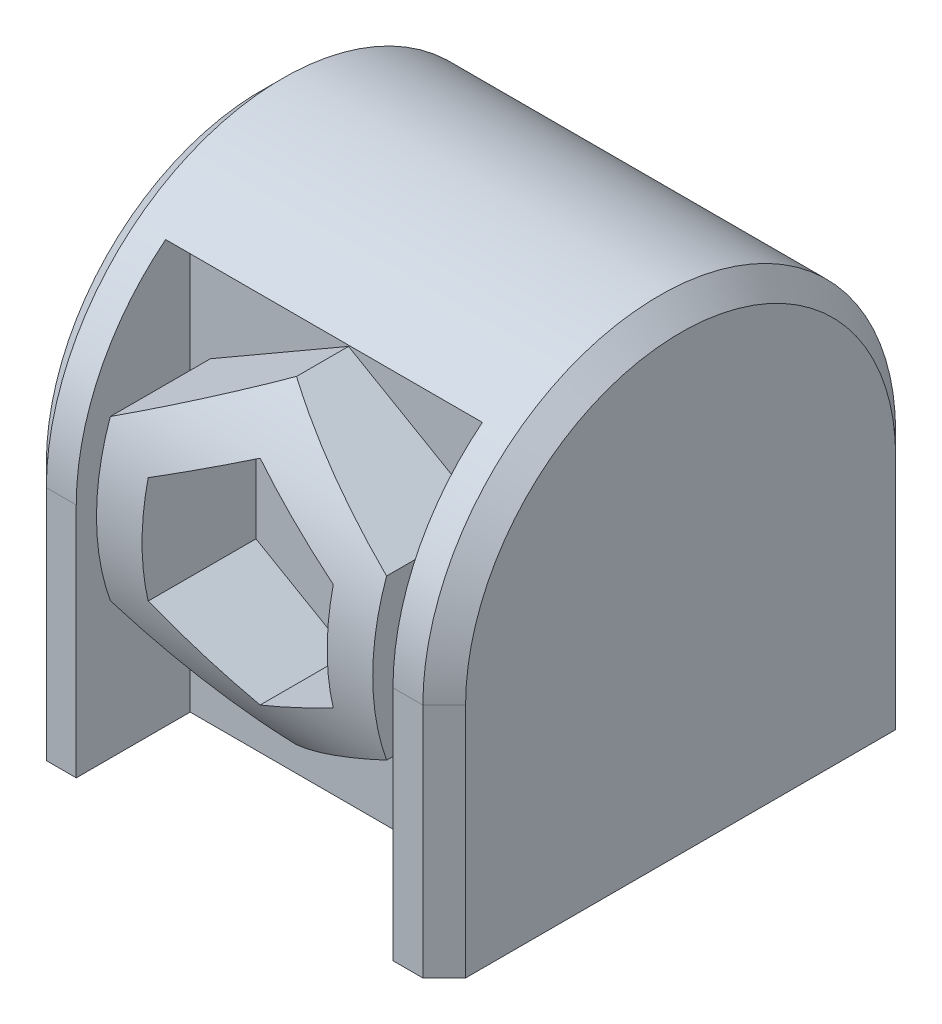
ISO-10303-21;
HEADER;
FILE_DESCRIPTION(('STEP AP214'),'2;1');
FILE_NAME('part.step','',(''),(''),'','','');
FILE_SCHEMA(('AUTOMOTIVE_DESIGN { 1 0 10303 214 1 1 1 1 }'));
ENDSEC;
DATA;
#1=APPLICATION_CONTEXT('core data for automotive mechanical design processes');
#2=APPLICATION_PROTOCOL_DEFINITION('international standard','automotive_design',2000,#1);
#3=PRODUCT_CONTEXT('',#1,'mechanical');
#4=PRODUCT('Part','Part','',(#3));
#5=PRODUCT_RELATED_PRODUCT_CATEGORY('part','',(#4));
#6=PRODUCT_DEFINITION_FORMATION('','',#4);
#7=PRODUCT_DEFINITION_CONTEXT('part definition',#1,'design');
#8=PRODUCT_DEFINITION('design','',#6,#7);
#9=PRODUCT_DEFINITION_SHAPE('','',#8);
#10=(LENGTH_UNIT() NAMED_UNIT(*) SI_UNIT(.MILLI.,.METRE.));
#11=(NAMED_UNIT(*) PLANE_ANGLE_UNIT() SI_UNIT($,.RADIAN.));
#12=(NAMED_UNIT(*) SI_UNIT($,.STERADIAN.) SOLID_ANGLE_UNIT());
#13=UNCERTAINTY_MEASURE_WITH_UNIT(LENGTH_MEASURE(1.E-05),#10,'distance_accuracy_value','');
#14=(GEOMETRIC_REPRESENTATION_CONTEXT(3) GLOBAL_UNCERTAINTY_ASSIGNED_CONTEXT((#13)) GLOBAL_UNIT_ASSIGNED_CONTEXT((#10,
#11,#12)) REPRESENTATION_CONTEXT('',''));
#15=CARTESIAN_POINT('',(0.,0.,0.));
#16=DIRECTION('',(0.,0.,1.));
#17=DIRECTION('',(1.,0.,0.));
#18=AXIS2_PLACEMENT_3D('',#15,#16,#17);
#19=CARTESIAN_POINT('',(0.,0.,5.461));
#20=DIRECTION('',(0.,0.,-1.));
#21=DIRECTION('',(-1.,0.,0.));
#22=AXIS2_PLACEMENT_3D('',#19,#20,#21);
#23=PLANE('',#22);
#24=DIRECTION('',(0.,1.,0.));
#25=VECTOR('',#24,1.);
#26=CARTESIAN_POINT('',(16.4084,-10.541,5.461));
#27=LINE('',#26,#25);
#28=CARTESIAN_POINT('',(16.4084,-10.541,5.461));
#29=VERTEX_POINT('',#28);
#30=CARTESIAN_POINT('',(16.4084,8.255,5.461));
#31=VERTEX_POINT('',#30);
#32=EDGE_CURVE('E398',#29,#31,#27,.T.);
#33=ORIENTED_EDGE('',*,*,#32,.T.);
#34=DIRECTION('',(-1.,0.,0.));
#35=VECTOR('',#34,1.);
#36=CARTESIAN_POINT('',(2.286,8.255,5.461));
#37=LINE('',#36,#35);
#38=CARTESIAN_POINT('',(2.286,8.255,5.461));
#39=VERTEX_POINT('',#38);
#40=EDGE_CURVE('E284',#31,#39,#37,.T.);
#41=ORIENTED_EDGE('',*,*,#40,.T.);
#42=DIRECTION('',(0.,-1.,0.));
#43=VECTOR('',#42,1.);
#44=CARTESIAN_POINT('',(2.286,-10.541,5.461));
#45=LINE('',#44,#43);
#46=CARTESIAN_POINT('',(2.286,-10.541,5.461));
#47=VERTEX_POINT('',#46);
#48=EDGE_CURVE('E264',#39,#47,#45,.T.);
#49=ORIENTED_EDGE('',*,*,#48,.T.);
#50=DIRECTION('',(1.,0.,0.));
#51=VECTOR('',#50,1.);
#52=CARTESIAN_POINT('',(2.286,-10.541,5.461));
#53=LINE('',#52,#51);
#54=EDGE_CURVE('E273',#47,#29,#53,.T.);
#55=ORIENTED_EDGE('',*,*,#54,.T.);
#56=EDGE_LOOP('',(#33,#41,#49,#55));
#57=FACE_BOUND('',#56,.T.);
#58=DIRECTION('',(-0.866025403784442,0.499999999999995,0.));
#59=VECTOR('',#58,1.);
#60=CARTESIAN_POINT('',(5.4163863358574,9.38145632712696,5.461));
#61=LINE('',#60,#59);
#62=CARTESIAN_POINT('',(15.5063726717149,3.55600000000007,5.461));
#63=VERTEX_POINT('',#62);
#64=CARTESIAN_POINT('',(9.3472,7.112,5.461));
#65=VERTEX_POINT('',#64);
#66=EDGE_CURVE('E11',#63,#65,#61,.T.);
#67=ORIENTED_EDGE('',*,*,#66,.F.);
#68=DIRECTION('',(0.,1.,0.));
#69=VECTOR('',#68,1.);
#70=CARTESIAN_POINT('',(15.5063726717149,1.6263618590233E-13,5.461));
#71=LINE('',#70,#69);
#72=CARTESIAN_POINT('',(15.506372671715,-3.55599999999994,5.461));
#73=VERTEX_POINT('',#72);
#74=EDGE_CURVE('E419',#73,#63,#71,.T.);
#75=ORIENTED_EDGE('',*,*,#74,.F.);
#76=DIRECTION('',(0.866025403784435,0.500000000000007,0.));
#77=VECTOR('',#76,1.);
#78=CARTESIAN_POINT('',(5.41638633585757,-9.38145632712696,5.461));
#79=LINE('',#78,#77);
#80=CARTESIAN_POINT('',(9.34720000000005,-7.112,5.461));
#81=VERTEX_POINT('',#80);
#82=EDGE_CURVE('E422',#81,#73,#79,.T.);
#83=ORIENTED_EDGE('',*,*,#82,.F.);
#84=DIRECTION('',(0.866025403784442,-0.499999999999995,0.));
#85=VECTOR('',#84,1.);
#86=CARTESIAN_POINT('',(-0.742786335857478,-1.28654367287309,5.461));
#87=LINE('',#86,#85);
#88=CARTESIAN_POINT('',(3.18802732828509,-3.55600000000003,5.461));
#89=VERTEX_POINT('',#88);
#90=EDGE_CURVE('E425',#89,#81,#87,.T.);
#91=ORIENTED_EDGE('',*,*,#90,.F.);
#92=DIRECTION('',(0.,-1.,0.));
#93=VECTOR('',#92,1.);
#94=CARTESIAN_POINT('',(3.18802732828508,0.,5.461));
#95=LINE('',#94,#93);
#96=CARTESIAN_POINT('',(3.18802732828506,3.55599999999999,5.461));
#97=VERTEX_POINT('',#96);
#98=EDGE_CURVE('E53',#97,#89,#95,.T.);
#99=ORIENTED_EDGE('',*,*,#98,.F.);
#100=DIRECTION('',(-0.866025403784438,-0.500000000000001,0.));
#101=VECTOR('',#100,1.);
#102=CARTESIAN_POINT('',(-0.742786335857459,1.28654367287304,5.461));
#103=LINE('',#102,#101);
#104=EDGE_CURVE('E43',#65,#97,#103,.T.);
#105=ORIENTED_EDGE('',*,*,#104,.F.);
#106=EDGE_LOOP('',(#67,#75,#83,#91,#99,#105));
#107=FACE_BOUND('',#106,.T.);
#108=ADVANCED_FACE('F34',(#57,#107),#23,.F.);
#109=CARTESIAN_POINT('',(2.286,8.255,4.191));
#110=DIRECTION('',(0.,1.,0.));
#111=DIRECTION('',(0.,0.,1.));
#112=AXIS2_PLACEMENT_3D('',#109,#110,#111);
#113=PLANE('',#112);
#114=ORIENTED_EDGE('',*,*,#40,.F.);
#115=DIRECTION('',(0.,0.,1.));
#116=VECTOR('',#115,1.);
#117=CARTESIAN_POINT('',(16.4084,8.255,4.191));
#118=LINE('',#117,#116);
#119=CARTESIAN_POINT('',(16.4084,8.255,6.55497185348648));
#120=VERTEX_POINT('',#119);
#121=EDGE_CURVE('E316',#31,#120,#118,.T.);
#122=ORIENTED_EDGE('',*,*,#121,.T.);
#123=DIRECTION('',(-1.,0.,0.));
#124=VECTOR('',#123,1.);
#125=CARTESIAN_POINT('',(18.6944,8.255,6.55497185348648));
#126=LINE('',#125,#124);
#127=CARTESIAN_POINT('',(2.286,8.255,6.55497185348648));
#128=VERTEX_POINT('',#127);
#129=EDGE_CURVE('E384',#128,#120,#126,.F.);
#130=ORIENTED_EDGE('',*,*,#129,.F.);
#131=DIRECTION('',(0.,0.,1.));
#132=VECTOR('',#131,1.);
#133=CARTESIAN_POINT('',(2.286,8.255,4.191));
#134=LINE('',#133,#132);
#135=EDGE_CURVE('E313',#39,#128,#134,.T.);
#136=ORIENTED_EDGE('',*,*,#135,.F.);
#137=EDGE_LOOP('',(#114,#122,#130,#136));
#138=FACE_BOUND('',#137,.T.);
#139=ADVANCED_FACE('F472',(#138),#113,.F.);
#140=CARTESIAN_POINT('',(2.286,-10.541,4.191));
#141=DIRECTION('',(-1.,0.,0.));
#142=DIRECTION('',(0.,0.,1.));
#143=AXIS2_PLACEMENT_3D('',#140,#141,#142);
#144=PLANE('',#143);
#145=ORIENTED_EDGE('',*,*,#48,.F.);
#146=ORIENTED_EDGE('',*,*,#135,.T.);
#147=CARTESIAN_POINT('',(2.286,0.,0.));
#148=DIRECTION('',(-1.,0.,0.));
#149=DIRECTION('',(0.,0.,1.));
#150=AXIS2_PLACEMENT_3D('',#147,#148,#149);
#151=CIRCLE('',#150,10.541);
#152=CARTESIAN_POINT('',(2.286,0.,10.541));
#153=VERTEX_POINT('',#152);
#154=EDGE_CURVE('E323',#153,#128,#151,.T.);
#155=ORIENTED_EDGE('',*,*,#154,.F.);
#156=DIRECTION('',(0.,-1.,0.));
#157=VECTOR('',#156,1.);
#158=CARTESIAN_POINT('',(2.286,-10.541,10.541));
#159=LINE('',#158,#157);
#160=CARTESIAN_POINT('',(2.286,-10.541,10.541));
#161=VERTEX_POINT('',#160);
#162=EDGE_CURVE('E307',#153,#161,#159,.T.);
#163=ORIENTED_EDGE('',*,*,#162,.T.);
#164=DIRECTION('',(0.,0.,1.));
#165=VECTOR('',#164,1.);
#166=CARTESIAN_POINT('',(2.286,-10.541,4.191));
#167=LINE('',#166,#165);
#168=EDGE_CURVE('E312',#47,#161,#167,.T.);
#169=ORIENTED_EDGE('',*,*,#168,.F.);
#170=EDGE_LOOP('',(#145,#146,#155,#163,#169));
#171=FACE_BOUND('',#170,.T.);
#172=ADVANCED_FACE('F479',(#171),#144,.F.);
#173=CARTESIAN_POINT('',(16.4084,-10.541,4.191));
#174=DIRECTION('',(1.,0.,0.));
#175=DIRECTION('',(0.,0.,-1.));
#176=AXIS2_PLACEMENT_3D('',#173,#174,#175);
#177=PLANE('',#176);
#178=ORIENTED_EDGE('',*,*,#32,.F.);
#179=DIRECTION('',(0.,0.,1.));
#180=VECTOR('',#179,1.);
#181=CARTESIAN_POINT('',(16.4084,-10.541,4.191));
#182=LINE('',#181,#180);
#183=CARTESIAN_POINT('',(16.4084,-10.541,10.541));
#184=VERTEX_POINT('',#183);
#185=EDGE_CURVE('E318',#29,#184,#182,.T.);
#186=ORIENTED_EDGE('',*,*,#185,.T.);
#187=DIRECTION('',(0.,1.,0.));
#188=VECTOR('',#187,1.);
#189=CARTESIAN_POINT('',(16.4084,-10.541,10.541));
#190=LINE('',#189,#188);
#191=CARTESIAN_POINT('',(16.4084,0.,10.541));
#192=VERTEX_POINT('',#191);
#193=EDGE_CURVE('E310',#184,#192,#190,.T.);
#194=ORIENTED_EDGE('',*,*,#193,.T.);
#195=CARTESIAN_POINT('',(16.4084,0.,0.));
#196=DIRECTION('',(1.,0.,0.));
#197=DIRECTION('',(0.,0.,-1.));
#198=AXIS2_PLACEMENT_3D('',#195,#196,#197);
#199=CIRCLE('',#198,10.541);
#200=EDGE_CURVE('E315',#120,#192,#199,.T.);
#201=ORIENTED_EDGE('',*,*,#200,.F.);
#202=ORIENTED_EDGE('',*,*,#121,.F.);
#203=EDGE_LOOP('',(#178,#186,#194,#201,#202));
#204=FACE_BOUND('',#203,.T.);
#205=ADVANCED_FACE('F647',(#204),#177,.F.);
#206=CARTESIAN_POINT('',(18.6944,0.,10.541));
#207=DIRECTION('',(0.,0.,-1.));
#208=DIRECTION('',(-1.,0.,0.));
#209=AXIS2_PLACEMENT_3D('',#206,#207,#208);
#210=PLANE('',#209);
#211=DIRECTION('',(-1.,0.,0.));
#212=VECTOR('',#211,1.);
#213=CARTESIAN_POINT('',(18.6944,-10.541,10.541));
#214=LINE('',#213,#212);
#215=CARTESIAN_POINT('',(0.952500000000005,-10.541,10.541));
#216=VERTEX_POINT('',#215);
#217=EDGE_CURVE('E337',#161,#216,#214,.T.);
#218=ORIENTED_EDGE('',*,*,#217,.F.);
#219=ORIENTED_EDGE('',*,*,#162,.F.);
#220=DIRECTION('',(-1.,0.,0.));
#221=VECTOR('',#220,1.);
#222=CARTESIAN_POINT('',(18.6944,0.,10.541));
#223=LINE('',#222,#221);
#224=CARTESIAN_POINT('',(0.952500000000002,0.,10.541));
#225=VERTEX_POINT('',#224);
#226=EDGE_CURVE('E341',#153,#225,#223,.T.);
#227=ORIENTED_EDGE('',*,*,#226,.T.);
#228=DIRECTION('',(0.,-1.,0.));
#229=VECTOR('',#228,1.);
#230=CARTESIAN_POINT('',(0.952500000000002,0.,10.541));
#231=LINE('',#230,#229);
#232=EDGE_CURVE('E369',#225,#216,#231,.T.);
#233=ORIENTED_EDGE('',*,*,#232,.T.);
#234=EDGE_LOOP('',(#218,#219,#227,#233));
#235=FACE_BOUND('',#234,.T.);
#236=ADVANCED_FACE('F672',(#235),#210,.F.);
#237=CARTESIAN_POINT('',(18.6944,-10.541,-10.541));
#238=DIRECTION('',(0.,0.,1.));
#239=DIRECTION('',(1.,0.,0.));
#240=AXIS2_PLACEMENT_3D('',#237,#238,#239);
#241=PLANE('',#240);
#242=DIRECTION('',(-1.,0.,0.));
#243=VECTOR('',#242,1.);
#244=CARTESIAN_POINT('',(18.6944,-10.541,-10.541));
#245=LINE('',#244,#243);
#246=CARTESIAN_POINT('',(17.7419,-10.541,-10.541));
#247=VERTEX_POINT('',#246);
#248=CARTESIAN_POINT('',(0.952500000000005,-10.541,-10.541));
#249=VERTEX_POINT('',#248);
#250=EDGE_CURVE('E330',#247,#249,#245,.T.);
#251=ORIENTED_EDGE('',*,*,#250,.T.);
#252=DIRECTION('',(0.,1.,0.));
#253=VECTOR('',#252,1.);
#254=CARTESIAN_POINT('',(0.952500000000002,-10.541,-10.541));
#255=LINE('',#254,#253);
#256=CARTESIAN_POINT('',(0.952500000000002,0.,-10.541));
#257=VERTEX_POINT('',#256);
#258=EDGE_CURVE('E350',#249,#257,#255,.T.);
#259=ORIENTED_EDGE('',*,*,#258,.T.);
#260=DIRECTION('',(-1.,0.,0.));
#261=VECTOR('',#260,1.);
#262=CARTESIAN_POINT('',(18.6944,0.,-10.541));
#263=LINE('',#262,#261);
#264=CARTESIAN_POINT('',(17.7419,0.,-10.541));
#265=VERTEX_POINT('',#264);
#266=EDGE_CURVE('E345',#265,#257,#263,.T.);
#267=ORIENTED_EDGE('',*,*,#266,.F.);
#268=DIRECTION('',(0.,-1.,0.));
#269=VECTOR('',#268,1.);
#270=CARTESIAN_POINT('',(17.7419,-10.541,-10.541));
#271=LINE('',#270,#269);
#272=EDGE_CURVE('E348',#265,#247,#271,.T.);
#273=ORIENTED_EDGE('',*,*,#272,.T.);
#274=EDGE_LOOP('',(#251,#259,#267,#273));
#275=FACE_BOUND('',#274,.T.);
#276=ADVANCED_FACE('F704',(#275),#241,.F.);
#277=CARTESIAN_POINT('',(18.6944,0.,0.));
#278=DIRECTION('',(-1.,0.,0.));
#279=DIRECTION('',(0.,0.,1.));
#280=AXIS2_PLACEMENT_3D('',#277,#278,#279);
#281=CYLINDRICAL_SURFACE('',#280,10.541);
#282=ORIENTED_EDGE('',*,*,#226,.F.);
#283=ORIENTED_EDGE('',*,*,#154,.T.);
#284=ORIENTED_EDGE('',*,*,#129,.T.);
#285=ORIENTED_EDGE('',*,*,#200,.T.);
#286=CARTESIAN_POINT('',(17.7419,0.,10.541));
#287=VERTEX_POINT('',#286);
#288=EDGE_CURVE('E342',#287,#192,#223,.T.);
#289=ORIENTED_EDGE('',*,*,#288,.F.);
#290=CARTESIAN_POINT('',(17.7419,0.,0.));
#291=DIRECTION('',(1.,0.,0.));
#292=DIRECTION('',(0.,0.,-1.));
#293=AXIS2_PLACEMENT_3D('',#290,#291,#292);
#294=CIRCLE('',#293,10.541);
#295=EDGE_CURVE('E372',#287,#265,#294,.F.);
#296=ORIENTED_EDGE('',*,*,#295,.T.);
#297=ORIENTED_EDGE('',*,*,#266,.T.);
#298=CARTESIAN_POINT('',(0.952500000000002,0.,0.));
#299=DIRECTION('',(1.,0.,0.));
#300=DIRECTION('',(0.,0.,-1.));
#301=AXIS2_PLACEMENT_3D('',#298,#299,#300);
#302=CIRCLE('',#301,10.541);
#303=EDGE_CURVE('E374',#257,#225,#302,.T.);
#304=ORIENTED_EDGE('',*,*,#303,.T.);
#305=EDGE_LOOP('',(#282,#283,#284,#285,#289,#296,#297,#304));
#306=FACE_BOUND('',#305,.T.);
#307=ADVANCED_FACE('F701',(#306),#281,.T.);
#308=ORIENTED_EDGE('',*,*,#288,.T.);
#309=ORIENTED_EDGE('',*,*,#193,.F.);
#310=CARTESIAN_POINT('',(17.7419,-10.541,10.541));
#311=VERTEX_POINT('',#310);
#312=EDGE_CURVE('E338',#311,#184,#214,.T.);
#313=ORIENTED_EDGE('',*,*,#312,.F.);
#314=DIRECTION('',(0.,1.,0.));
#315=VECTOR('',#314,1.);
#316=CARTESIAN_POINT('',(17.7419,0.,10.541));
#317=LINE('',#316,#315);
#318=EDGE_CURVE('E367',#311,#287,#317,.T.);
#319=ORIENTED_EDGE('',*,*,#318,.T.);
#320=EDGE_LOOP('',(#308,#309,#313,#319));
#321=FACE_BOUND('',#320,.T.);
#322=ADVANCED_FACE('F688',(#321),#210,.F.);
#323=CARTESIAN_POINT('',(18.6944,-10.541,10.541));
#324=DIRECTION('',(0.,1.,0.));
#325=DIRECTION('',(0.,0.,1.));
#326=AXIS2_PLACEMENT_3D('',#323,#324,#325);
#327=PLANE('',#326);
#328=ORIENTED_EDGE('',*,*,#185,.F.);
#329=ORIENTED_EDGE('',*,*,#54,.F.);
#330=ORIENTED_EDGE('',*,*,#168,.T.);
#331=ORIENTED_EDGE('',*,*,#217,.T.);
#332=DIRECTION('',(0.707106781186547,0.,0.707106781186548));
#333=VECTOR('',#332,1.);
#334=CARTESIAN_POINT('',(0.952500000000002,-10.541,10.541));
#335=LINE('',#334,#333);
#336=CARTESIAN_POINT('',(0.,-10.541,9.5885));
#337=VERTEX_POINT('',#336);
#338=EDGE_CURVE('E363',#216,#337,#335,.F.);
#339=ORIENTED_EDGE('',*,*,#338,.T.);
#340=DIRECTION('',(0.,0.,-1.));
#341=VECTOR('',#340,1.);
#342=CARTESIAN_POINT('',(0.,-10.541,10.541));
#343=LINE('',#342,#341);
#344=CARTESIAN_POINT('',(0.,-10.541,-9.58849999999999));
#345=VERTEX_POINT('',#344);
#346=EDGE_CURVE('E331',#337,#345,#343,.T.);
#347=ORIENTED_EDGE('',*,*,#346,.T.);
#348=DIRECTION('',(-0.707106781186547,0.,0.707106781186548));
#349=VECTOR('',#348,1.);
#350=CARTESIAN_POINT('',(0.952500000000002,-10.541,-10.541));
#351=LINE('',#350,#349);
#352=EDGE_CURVE('E365',#345,#249,#351,.F.);
#353=ORIENTED_EDGE('',*,*,#352,.T.);
#354=ORIENTED_EDGE('',*,*,#250,.F.);
#355=DIRECTION('',(0.707106781186549,0.,0.707106781186546));
#356=VECTOR('',#355,1.);
#357=CARTESIAN_POINT('',(18.6944,-10.541,-9.58850000000001));
#358=LINE('',#357,#356);
#359=CARTESIAN_POINT('',(18.6944,-10.541,-9.58850000000001));
#360=VERTEX_POINT('',#359);
#361=EDGE_CURVE('E361',#247,#360,#358,.T.);
#362=ORIENTED_EDGE('',*,*,#361,.T.);
#363=DIRECTION('',(0.,0.,-1.));
#364=VECTOR('',#363,1.);
#365=CARTESIAN_POINT('',(18.6944,-10.541,10.541));
#366=LINE('',#365,#364);
#367=CARTESIAN_POINT('',(18.6944,-10.541,9.58850000000001));
#368=VERTEX_POINT('',#367);
#369=EDGE_CURVE('E327',#368,#360,#366,.T.);
#370=ORIENTED_EDGE('',*,*,#369,.F.);
#371=DIRECTION('',(-0.707106781186549,0.,0.707106781186546));
#372=VECTOR('',#371,1.);
#373=CARTESIAN_POINT('',(18.6944,-10.541,9.58850000000001));
#374=LINE('',#373,#372);
#375=EDGE_CURVE('E359',#368,#311,#374,.T.);
#376=ORIENTED_EDGE('',*,*,#375,.T.);
#377=ORIENTED_EDGE('',*,*,#312,.T.);
#378=EDGE_LOOP('',(#328,#329,#330,#331,#339,#347,#353,#354,#362,#370,#376,#377));
#379=FACE_BOUND('',#378,.T.);
#380=ADVANCED_FACE('F682',(#379),#327,.F.);
#381=CARTESIAN_POINT('',(18.6944,0.,0.));
#382=DIRECTION('',(1.,0.,0.));
#383=DIRECTION('',(0.,0.,-1.));
#384=AXIS2_PLACEMENT_3D('',#381,#382,#383);
#385=PLANE('',#384);
#386=ORIENTED_EDGE('',*,*,#369,.T.);
#387=DIRECTION('',(0.,1.,0.));
#388=VECTOR('',#387,1.);
#389=CARTESIAN_POINT('',(18.6944,0.,-9.58850000000001));
#390=LINE('',#389,#388);
#391=CARTESIAN_POINT('',(18.6944,0.,-9.58850000000001));
#392=VERTEX_POINT('',#391);
#393=EDGE_CURVE('E381',#360,#392,#390,.T.);
#394=ORIENTED_EDGE('',*,*,#393,.T.);
#395=CARTESIAN_POINT('',(18.6944,0.,0.));
#396=DIRECTION('',(1.,0.,0.));
#397=DIRECTION('',(0.,0.,-1.));
#398=AXIS2_PLACEMENT_3D('',#395,#396,#397);
#399=CIRCLE('',#398,9.58850000000001);
#400=CARTESIAN_POINT('',(18.6944,0.,9.58850000000001));
#401=VERTEX_POINT('',#400);
#402=EDGE_CURVE('E377',#392,#401,#399,.T.);
#403=ORIENTED_EDGE('',*,*,#402,.T.);
#404=DIRECTION('',(0.,-1.,0.));
#405=VECTOR('',#404,1.);
#406=CARTESIAN_POINT('',(18.6944,-10.541,9.58850000000001));
#407=LINE('',#406,#405);
#408=EDGE_CURVE('E379',#401,#368,#407,.T.);
#409=ORIENTED_EDGE('',*,*,#408,.T.);
#410=EDGE_LOOP('',(#386,#394,#403,#409));
#411=FACE_BOUND('',#410,.T.);
#412=ADVANCED_FACE('F711',(#411),#385,.T.);
#413=CARTESIAN_POINT('',(0.,0.,0.));
#414=DIRECTION('',(1.,0.,0.));
#415=DIRECTION('',(0.,0.,-1.));
#416=AXIS2_PLACEMENT_3D('',#413,#414,#415);
#417=PLANE('',#416);
#418=CARTESIAN_POINT('',(0.,0.,0.));
#419=DIRECTION('',(1.,0.,0.));
#420=DIRECTION('',(0.,0.,-1.));
#421=AXIS2_PLACEMENT_3D('',#418,#419,#420);
#422=CIRCLE('',#421,9.5885);
#423=CARTESIAN_POINT('',(0.,0.,9.5885));
#424=VERTEX_POINT('',#423);
#425=CARTESIAN_POINT('',(0.,0.,-9.5885));
#426=VERTEX_POINT('',#425);
#427=EDGE_CURVE('E353',#424,#426,#422,.F.);
#428=ORIENTED_EDGE('',*,*,#427,.T.);
#429=DIRECTION('',(0.,-1.,0.));
#430=VECTOR('',#429,1.);
#431=CARTESIAN_POINT('',(0.,0.,-9.5885));
#432=LINE('',#431,#430);
#433=EDGE_CURVE('E357',#426,#345,#432,.T.);
#434=ORIENTED_EDGE('',*,*,#433,.T.);
#435=ORIENTED_EDGE('',*,*,#346,.F.);
#436=DIRECTION('',(0.,1.,0.));
#437=VECTOR('',#436,1.);
#438=CARTESIAN_POINT('',(0.,0.,9.5885));
#439=LINE('',#438,#437);
#440=EDGE_CURVE('E355',#337,#424,#439,.T.);
#441=ORIENTED_EDGE('',*,*,#440,.T.);
#442=EDGE_LOOP('',(#428,#434,#435,#441));
#443=FACE_BOUND('',#442,.T.);
#444=ADVANCED_FACE('F713',(#443),#417,.F.);
#445=CARTESIAN_POINT('',(0.952500000000002,0.,10.541));
#446=DIRECTION('',(0.707106781186548,0.,-0.707106781186547));
#447=DIRECTION('',(0.,-1.,0.));
#448=AXIS2_PLACEMENT_3D('',#445,#446,#447);
#449=PLANE('',#448);
#450=ORIENTED_EDGE('',*,*,#338,.F.);
#451=ORIENTED_EDGE('',*,*,#232,.F.);
#452=DIRECTION('',(0.707106781186547,0.,0.707106781186548));
#453=VECTOR('',#452,1.);
#454=CARTESIAN_POINT('',(0.,0.,9.5885));
#455=LINE('',#454,#453);
#456=EDGE_CURVE('E334',#424,#225,#455,.T.);
#457=ORIENTED_EDGE('',*,*,#456,.F.);
#458=ORIENTED_EDGE('',*,*,#440,.F.);
#459=EDGE_LOOP('',(#450,#451,#457,#458));
#460=FACE_BOUND('',#459,.T.);
#461=ADVANCED_FACE('F718',(#460),#449,.F.);
#462=CARTESIAN_POINT('',(0.952500000000002,0.,0.));
#463=DIRECTION('',(1.,0.,0.));
#464=DIRECTION('',(0.,0.,-1.));
#465=AXIS2_PLACEMENT_3D('',#462,#463,#464);
#466=CONICAL_SURFACE('',#465,10.541,0.785398163397449);
#467=ORIENTED_EDGE('',*,*,#456,.T.);
#468=ORIENTED_EDGE('',*,*,#303,.F.);
#469=DIRECTION('',(0.707106781186547,0.,-0.707106781186548));
#470=VECTOR('',#469,1.);
#471=CARTESIAN_POINT('',(0.,0.,-9.5885));
#472=LINE('',#471,#470);
#473=EDGE_CURVE('E385',#426,#257,#472,.T.);
#474=ORIENTED_EDGE('',*,*,#473,.F.);
#475=ORIENTED_EDGE('',*,*,#427,.F.);
#476=EDGE_LOOP('',(#467,#468,#474,#475));
#477=FACE_BOUND('',#476,.T.);
#478=ADVANCED_FACE('F732',(#477),#466,.T.);
#479=CARTESIAN_POINT('',(0.952500000000002,-10.541,-10.541));
#480=DIRECTION('',(0.707106781186548,0.,0.707106781186547));
#481=DIRECTION('',(0.,1.,0.));
#482=AXIS2_PLACEMENT_3D('',#479,#480,#481);
#483=PLANE('',#482);
#484=ORIENTED_EDGE('',*,*,#352,.F.);
#485=ORIENTED_EDGE('',*,*,#433,.F.);
#486=ORIENTED_EDGE('',*,*,#473,.T.);
#487=ORIENTED_EDGE('',*,*,#258,.F.);
#488=EDGE_LOOP('',(#484,#485,#486,#487));
#489=FACE_BOUND('',#488,.T.);
#490=ADVANCED_FACE('F729',(#489),#483,.F.);
#491=CARTESIAN_POINT('',(18.6944,0.,9.58850000000001));
#492=DIRECTION('',(0.707106781186545,0.,0.707106781186549));
#493=DIRECTION('',(0.,1.,0.));
#494=AXIS2_PLACEMENT_3D('',#491,#492,#493);
#495=PLANE('',#494);
#496=ORIENTED_EDGE('',*,*,#375,.F.);
#497=ORIENTED_EDGE('',*,*,#408,.F.);
#498=DIRECTION('',(0.707106781186549,0.,-0.707106781186545));
#499=VECTOR('',#498,1.);
#500=CARTESIAN_POINT('',(17.7419,0.,10.541));
#501=LINE('',#500,#499);
#502=EDGE_CURVE('E387',#287,#401,#501,.T.);
#503=ORIENTED_EDGE('',*,*,#502,.F.);
#504=ORIENTED_EDGE('',*,*,#318,.F.);
#505=EDGE_LOOP('',(#496,#497,#503,#504));
#506=FACE_BOUND('',#505,.T.);
#507=ADVANCED_FACE('F36',(#506),#495,.T.);
#508=CARTESIAN_POINT('',(18.6944,0.,0.));
#509=DIRECTION('',(-1.,0.,0.));
#510=DIRECTION('',(0.,0.,1.));
#511=AXIS2_PLACEMENT_3D('',#508,#509,#510);
#512=CONICAL_SURFACE('',#511,9.58850000000001,0.785398163397446);
#513=ORIENTED_EDGE('',*,*,#502,.T.);
#514=ORIENTED_EDGE('',*,*,#402,.F.);
#515=DIRECTION('',(0.707106781186549,0.,0.707106781186545));
#516=VECTOR('',#515,1.);
#517=CARTESIAN_POINT('',(17.7419,0.,-10.541));
#518=LINE('',#517,#516);
#519=EDGE_CURVE('E326',#265,#392,#518,.T.);
#520=ORIENTED_EDGE('',*,*,#519,.F.);
#521=ORIENTED_EDGE('',*,*,#295,.F.);
#522=EDGE_LOOP('',(#513,#514,#520,#521));
#523=FACE_BOUND('',#522,.T.);
#524=ADVANCED_FACE('F697',(#523),#512,.T.);
#525=CARTESIAN_POINT('',(18.6944,0.,-9.58850000000001));
#526=DIRECTION('',(0.707106781186545,0.,-0.707106781186549));
#527=DIRECTION('',(0.,-1.,0.));
#528=AXIS2_PLACEMENT_3D('',#525,#526,#527);
#529=PLANE('',#528);
#530=ORIENTED_EDGE('',*,*,#361,.F.);
#531=ORIENTED_EDGE('',*,*,#272,.F.);
#532=ORIENTED_EDGE('',*,*,#519,.T.);
#533=ORIENTED_EDGE('',*,*,#393,.F.);
#534=EDGE_LOOP('',(#530,#531,#532,#533));
#535=FACE_BOUND('',#534,.T.);
#536=ADVANCED_FACE('F533',(#535),#529,.T.);
#537=CARTESIAN_POINT('',(15.5063726717149,3.55600000000007,10.542));
#538=DIRECTION('',(-0.499999999999995,-0.866025403784442,0.));
#539=DIRECTION('',(0.866025403784442,-0.499999999999995,0.));
#540=AXIS2_PLACEMENT_3D('',#537,#538,#539);
#541=PLANE('',#540);
#542=DIRECTION('',(0.,0.,-1.));
#543=VECTOR('',#542,1.);
#544=CARTESIAN_POINT('',(15.5063726717149,3.55600000000007,10.542));
#545=LINE('',#544,#543);
#546=CARTESIAN_POINT('',(15.5063726717149,3.55600000000007,9.9230814266537));
#547=VERTEX_POINT('',#546);
#548=EDGE_CURVE('E233',#547,#63,#545,.T.);
#549=ORIENTED_EDGE('',*,*,#548,.T.);
#550=ORIENTED_EDGE('',*,*,#66,.T.);
#551=DIRECTION('',(0.,0.,-1.));
#552=VECTOR('',#551,1.);
#553=CARTESIAN_POINT('',(9.3472,7.112,10.542));
#554=LINE('',#553,#552);
#555=CARTESIAN_POINT('',(9.3472,7.112,7.78024016338828));
#556=VERTEX_POINT('',#555);
#557=EDGE_CURVE('E232',#556,#65,#554,.T.);
#558=ORIENTED_EDGE('',*,*,#557,.F.);
#559=CARTESIAN_POINT('',(21.66554534343,0.,0.));
#560=DIRECTION('',(-0.499999999999995,-0.866025403784442,0.));
#561=DIRECTION('',(-0.866025403784442,0.499999999999995,0.));
#562=AXIS2_PLACEMENT_3D('',#559,#560,#561);
#563=ELLIPSE('',#562,21.0820000000002,10.541);
#564=EDGE_CURVE('E228',#556,#547,#563,.F.);
#565=ORIENTED_EDGE('',*,*,#564,.T.);
#566=EDGE_LOOP('',(#549,#550,#558,#565));
#567=FACE_BOUND('',#566,.T.);
#568=ADVANCED_FACE('F456',(#567),#541,.F.);
#569=CARTESIAN_POINT('',(9.3472,7.112,10.542));
#570=DIRECTION('',(0.500000000000001,-0.866025403784438,0.));
#571=DIRECTION('',(0.866025403784438,0.500000000000001,0.));
#572=AXIS2_PLACEMENT_3D('',#569,#570,#571);
#573=PLANE('',#572);
#574=ORIENTED_EDGE('',*,*,#557,.T.);
#575=ORIENTED_EDGE('',*,*,#104,.T.);
#576=DIRECTION('',(0.,0.,-1.));
#577=VECTOR('',#576,1.);
#578=CARTESIAN_POINT('',(3.18802732828506,3.55599999999999,10.542));
#579=LINE('',#578,#577);
#580=CARTESIAN_POINT('',(3.18802732828506,3.55599999999999,9.92308142665373));
#581=VERTEX_POINT('',#580);
#582=EDGE_CURVE('E236',#581,#97,#579,.T.);
#583=ORIENTED_EDGE('',*,*,#582,.F.);
#584=CARTESIAN_POINT('',(-2.97114534342983,0.,0.));
#585=DIRECTION('',(0.500000000000001,-0.866025403784438,0.));
#586=DIRECTION('',(-0.866025403784438,-0.500000000000001,0.));
#587=AXIS2_PLACEMENT_3D('',#584,#585,#586);
#588=ELLIPSE('',#587,21.082,10.541);
#589=EDGE_CURVE('E221',#581,#556,#588,.F.);
#590=ORIENTED_EDGE('',*,*,#589,.T.);
#591=EDGE_LOOP('',(#574,#575,#583,#590));
#592=FACE_BOUND('',#591,.T.);
#593=ADVANCED_FACE('F237',(#592),#573,.F.);
#594=CARTESIAN_POINT('',(3.18802732828506,3.55599999999999,10.542));
#595=DIRECTION('',(1.,0.,0.));
#596=DIRECTION('',(0.,1.,0.));
#597=AXIS2_PLACEMENT_3D('',#594,#595,#596);
#598=PLANE('',#597);
#599=ORIENTED_EDGE('',*,*,#582,.T.);
#600=ORIENTED_EDGE('',*,*,#98,.T.);
#601=DIRECTION('',(0.,0.,-1.));
#602=VECTOR('',#601,1.);
#603=CARTESIAN_POINT('',(3.18802732828509,-3.55600000000003,10.542));
#604=LINE('',#603,#602);
#605=CARTESIAN_POINT('',(3.18802732828509,-3.55600000000003,9.92308142665371));
#606=VERTEX_POINT('',#605);
#607=EDGE_CURVE('E243',#606,#89,#604,.T.);
#608=ORIENTED_EDGE('',*,*,#607,.F.);
#609=CARTESIAN_POINT('',(3.18802732828508,0.,0.));
#610=DIRECTION('',(1.,0.,0.));
#611=DIRECTION('',(0.,1.,0.));
#612=AXIS2_PLACEMENT_3D('',#609,#610,#611);
#613=CIRCLE('',#612,10.541);
#614=EDGE_CURVE('E225',#606,#581,#613,.F.);
#615=ORIENTED_EDGE('',*,*,#614,.T.);
#616=EDGE_LOOP('',(#599,#600,#608,#615));
#617=FACE_BOUND('',#616,.T.);
#618=ADVANCED_FACE('F241',(#617),#598,.F.);
#619=CARTESIAN_POINT('',(3.18802732828509,-3.55600000000003,10.542));
#620=DIRECTION('',(0.499999999999995,0.866025403784442,0.));
#621=DIRECTION('',(-0.866025403784442,0.499999999999995,0.));
#622=AXIS2_PLACEMENT_3D('',#619,#620,#621);
#623=PLANE('',#622);
#624=ORIENTED_EDGE('',*,*,#607,.T.);
#625=ORIENTED_EDGE('',*,*,#90,.T.);
#626=DIRECTION('',(0.,0.,-1.));
#627=VECTOR('',#626,1.);
#628=CARTESIAN_POINT('',(9.34720000000005,-7.112,10.542));
#629=LINE('',#628,#627);
#630=CARTESIAN_POINT('',(9.34720000000005,-7.112,7.78024016338828));
#631=VERTEX_POINT('',#630);
#632=EDGE_CURVE('E253',#631,#81,#629,.T.);
#633=ORIENTED_EDGE('',*,*,#632,.F.);
#634=CARTESIAN_POINT('',(-2.97114534342997,0.,0.));
#635=DIRECTION('',(0.499999999999995,0.866025403784442,0.));
#636=DIRECTION('',(-0.866025403784442,0.499999999999995,0.));
#637=AXIS2_PLACEMENT_3D('',#634,#635,#636);
#638=ELLIPSE('',#637,21.0820000000002,10.541);
#639=EDGE_CURVE('E239',#631,#606,#638,.F.);
#640=ORIENTED_EDGE('',*,*,#639,.T.);
#641=EDGE_LOOP('',(#624,#625,#633,#640));
#642=FACE_BOUND('',#641,.T.);
#643=ADVANCED_FACE('F429',(#642),#623,.F.);
#644=CARTESIAN_POINT('',(9.34720000000005,-7.112,10.542));
#645=DIRECTION('',(-0.500000000000007,0.866025403784434,0.));
#646=DIRECTION('',(-0.866025403784435,-0.500000000000007,0.));
#647=AXIS2_PLACEMENT_3D('',#644,#645,#646);
#648=PLANE('',#647);
#649=ORIENTED_EDGE('',*,*,#632,.T.);
#650=ORIENTED_EDGE('',*,*,#82,.T.);
#651=DIRECTION('',(0.,0.,-1.));
#652=VECTOR('',#651,1.);
#653=CARTESIAN_POINT('',(15.506372671715,-3.55599999999994,10.542));
#654=LINE('',#653,#652);
#655=CARTESIAN_POINT('',(15.506372671715,-3.55599999999994,9.92308142665374));
#656=VERTEX_POINT('',#655);
#657=EDGE_CURVE('E257',#656,#73,#654,.T.);
#658=ORIENTED_EDGE('',*,*,#657,.F.);
#659=CARTESIAN_POINT('',(21.6655453434297,0.,0.));
#660=DIRECTION('',(-0.500000000000007,0.866025403784434,0.));
#661=DIRECTION('',(-0.866025403784435,-0.500000000000007,0.));
#662=AXIS2_PLACEMENT_3D('',#659,#660,#661);
#663=ELLIPSE('',#662,21.0819999999997,10.541);
#664=EDGE_CURVE('E250',#656,#631,#663,.F.);
#665=ORIENTED_EDGE('',*,*,#664,.T.);
#666=EDGE_LOOP('',(#649,#650,#658,#665));
#667=FACE_BOUND('',#666,.T.);
#668=ADVANCED_FACE('F461',(#667),#648,.F.);
#669=CARTESIAN_POINT('',(15.506372671715,-3.55599999999994,10.542));
#670=DIRECTION('',(-1.,0.,0.));
#671=DIRECTION('',(0.,-1.,0.));
#672=AXIS2_PLACEMENT_3D('',#669,#670,#671);
#673=PLANE('',#672);
#674=ORIENTED_EDGE('',*,*,#657,.T.);
#675=ORIENTED_EDGE('',*,*,#74,.T.);
#676=ORIENTED_EDGE('',*,*,#548,.F.);
#677=CARTESIAN_POINT('',(15.5063726717149,0.,0.));
#678=DIRECTION('',(-1.,0.,0.));
#679=DIRECTION('',(0.,-1.,0.));
#680=AXIS2_PLACEMENT_3D('',#677,#678,#679);
#681=CIRCLE('',#680,10.541);
#682=EDGE_CURVE('E254',#547,#656,#681,.F.);
#683=ORIENTED_EDGE('',*,*,#682,.T.);
#684=EDGE_LOOP('',(#674,#675,#676,#683));
#685=FACE_BOUND('',#684,.T.);
#686=ADVANCED_FACE('F458',(#685),#673,.F.);
#687=CARTESIAN_POINT('',(13.4743726717149,2.38282425300668,10.542));
#688=DIRECTION('',(-0.5,-0.866025403784439,0.));
#689=DIRECTION('',(0.866025403784439,-0.5,0.));
#690=AXIS2_PLACEMENT_3D('',#687,#688,#689);
#691=PLANE('',#690);
#692=DIRECTION('',(-0.866025403784439,0.5,0.));
#693=VECTOR('',#692,1.);
#694=CARTESIAN_POINT('',(4.40038633585746,7.62169270663698,5.461));
#695=LINE('',#694,#693);
#696=CARTESIAN_POINT('',(13.4743726717149,2.38282425300668,5.461));
#697=VERTEX_POINT('',#696);
#698=CARTESIAN_POINT('',(9.3472,4.76564850601337,5.461));
#699=VERTEX_POINT('',#698);
#700=EDGE_CURVE('E416',#697,#699,#695,.T.);
#701=ORIENTED_EDGE('',*,*,#700,.F.);
#702=DIRECTION('',(0.,0.,-1.));
#703=VECTOR('',#702,1.);
#704=CARTESIAN_POINT('',(13.4743726717149,2.38282425300668,10.542));
#705=LINE('',#704,#703);
#706=CARTESIAN_POINT('',(13.4743726717149,2.38282425300668,10.268146355564));
#707=VERTEX_POINT('',#706);
#708=EDGE_CURVE('E261',#707,#697,#705,.T.);
#709=ORIENTED_EDGE('',*,*,#708,.F.);
#710=CARTESIAN_POINT('',(17.6015453434299,0.,0.));
#711=DIRECTION('',(-0.5,-0.866025403784439,0.));
#712=DIRECTION('',(-0.866025403784439,0.5,0.));
#713=AXIS2_PLACEMENT_3D('',#710,#711,#712);
#714=ELLIPSE('',#713,21.082,10.541);
#715=CARTESIAN_POINT('',(9.3472,4.76564850601337,9.40219523925836));
#716=VERTEX_POINT('',#715);
#717=EDGE_CURVE('E258',#716,#707,#714,.F.);
#718=ORIENTED_EDGE('',*,*,#717,.F.);
#719=DIRECTION('',(0.,0.,-1.));
#720=VECTOR('',#719,1.);
#721=CARTESIAN_POINT('',(9.3472,4.76564850601337,10.542));
#722=LINE('',#721,#720);
#723=EDGE_CURVE('E437',#716,#699,#722,.T.);
#724=ORIENTED_EDGE('',*,*,#723,.T.);
#725=EDGE_LOOP('',(#701,#709,#718,#724));
#726=FACE_BOUND('',#725,.T.);
#727=ADVANCED_FACE('F468',(#726),#691,.T.);
#728=CARTESIAN_POINT('',(9.3472,4.76564850601337,10.542));
#729=DIRECTION('',(0.5,-0.866025403784439,0.));
#730=DIRECTION('',(0.866025403784439,0.5,0.));
#731=AXIS2_PLACEMENT_3D('',#728,#729,#730);
#732=PLANE('',#731);
#733=DIRECTION('',(-0.866025403784439,-0.5,0.));
#734=VECTOR('',#733,1.);
#735=CARTESIAN_POINT('',(0.273213664142531,-0.473219947616924,5.461));
#736=LINE('',#735,#734);
#737=CARTESIAN_POINT('',(5.22002732828506,2.38282425300668,5.461));
#738=VERTEX_POINT('',#737);
#739=EDGE_CURVE('E413',#699,#738,#736,.T.);
#740=ORIENTED_EDGE('',*,*,#739,.F.);
#741=ORIENTED_EDGE('',*,*,#723,.F.);
#742=CARTESIAN_POINT('',(1.09285465657013,0.,0.));
#743=DIRECTION('',(0.5,-0.866025403784439,0.));
#744=DIRECTION('',(-0.866025403784439,-0.5,0.));
#745=AXIS2_PLACEMENT_3D('',#742,#743,#744);
#746=ELLIPSE('',#745,21.082,10.541);
#747=CARTESIAN_POINT('',(5.22002732828506,2.38282425300668,10.268146355564));
#748=VERTEX_POINT('',#747);
#749=EDGE_CURVE('E262',#748,#716,#746,.F.);
#750=ORIENTED_EDGE('',*,*,#749,.F.);
#751=DIRECTION('',(0.,0.,-1.));
#752=VECTOR('',#751,1.);
#753=CARTESIAN_POINT('',(5.22002732828506,2.38282425300668,10.542));
#754=LINE('',#753,#752);
#755=EDGE_CURVE('E442',#748,#738,#754,.T.);
#756=ORIENTED_EDGE('',*,*,#755,.T.);
#757=EDGE_LOOP('',(#740,#741,#750,#756));
#758=FACE_BOUND('',#757,.T.);
#759=ADVANCED_FACE('F511',(#758),#732,.T.);
#760=CARTESIAN_POINT('',(5.22002732828506,2.38282425300668,10.542));
#761=DIRECTION('',(1.,0.,0.));
#762=DIRECTION('',(0.,1.,0.));
#763=AXIS2_PLACEMENT_3D('',#760,#761,#762);
#764=PLANE('',#763);
#765=DIRECTION('',(0.,-1.,0.));
#766=VECTOR('',#765,1.);
#767=CARTESIAN_POINT('',(5.22002732828506,0.,5.461));
#768=LINE('',#767,#766);
#769=CARTESIAN_POINT('',(5.22002732828506,-2.38282425300669,5.461));
#770=VERTEX_POINT('',#769);
#771=EDGE_CURVE('E410',#738,#770,#768,.T.);
#772=ORIENTED_EDGE('',*,*,#771,.F.);
#773=ORIENTED_EDGE('',*,*,#755,.F.);
#774=CARTESIAN_POINT('',(5.22002732828506,0.,0.));
#775=DIRECTION('',(1.,0.,0.));
#776=DIRECTION('',(0.,1.,0.));
#777=AXIS2_PLACEMENT_3D('',#774,#775,#776);
#778=CIRCLE('',#777,10.541);
#779=CARTESIAN_POINT('',(5.22002732828506,-2.38282425300669,10.2681463555641));
#780=VERTEX_POINT('',#779);
#781=EDGE_CURVE('E265',#780,#748,#778,.F.);
#782=ORIENTED_EDGE('',*,*,#781,.F.);
#783=DIRECTION('',(0.,0.,-1.));
#784=VECTOR('',#783,1.);
#785=CARTESIAN_POINT('',(5.22002732828506,-2.38282425300669,10.542));
#786=LINE('',#785,#784);
#787=EDGE_CURVE('E445',#780,#770,#786,.T.);
#788=ORIENTED_EDGE('',*,*,#787,.T.);
#789=EDGE_LOOP('',(#772,#773,#782,#788));
#790=FACE_BOUND('',#789,.T.);
#791=ADVANCED_FACE('F507',(#790),#764,.T.);
#792=CARTESIAN_POINT('',(5.22002732828506,-2.38282425300669,10.542));
#793=DIRECTION('',(0.5,0.866025403784439,0.));
#794=DIRECTION('',(-0.866025403784439,0.5,0.));
#795=AXIS2_PLACEMENT_3D('',#792,#793,#794);
#796=PLANE('',#795);
#797=DIRECTION('',(0.866025403784439,-0.5,0.));
#798=VECTOR('',#797,1.);
#799=CARTESIAN_POINT('',(0.273213664142532,0.473219947616924,5.461));
#800=LINE('',#799,#798);
#801=CARTESIAN_POINT('',(9.3472,-4.76564850601337,5.461));
#802=VERTEX_POINT('',#801);
#803=EDGE_CURVE('E407',#770,#802,#800,.T.);
#804=ORIENTED_EDGE('',*,*,#803,.F.);
#805=ORIENTED_EDGE('',*,*,#787,.F.);
#806=CARTESIAN_POINT('',(1.09285465657013,0.,0.));
#807=DIRECTION('',(0.5,0.866025403784439,0.));
#808=DIRECTION('',(-0.866025403784439,0.5,0.));
#809=AXIS2_PLACEMENT_3D('',#806,#807,#808);
#810=ELLIPSE('',#809,21.082,10.541);
#811=CARTESIAN_POINT('',(9.3472,-4.76564850601337,9.40219523925836));
#812=VERTEX_POINT('',#811);
#813=EDGE_CURVE('E267',#812,#780,#810,.F.);
#814=ORIENTED_EDGE('',*,*,#813,.F.);
#815=DIRECTION('',(0.,0.,-1.));
#816=VECTOR('',#815,1.);
#817=CARTESIAN_POINT('',(9.3472,-4.76564850601337,10.542));
#818=LINE('',#817,#816);
#819=EDGE_CURVE('E448',#812,#802,#818,.T.);
#820=ORIENTED_EDGE('',*,*,#819,.T.);
#821=EDGE_LOOP('',(#804,#805,#814,#820));
#822=FACE_BOUND('',#821,.T.);
#823=ADVANCED_FACE('F505',(#822),#796,.T.);
#824=CARTESIAN_POINT('',(9.3472,-4.76564850601337,10.542));
#825=DIRECTION('',(-0.5,0.866025403784439,0.));
#826=DIRECTION('',(-0.866025403784439,-0.5,0.));
#827=AXIS2_PLACEMENT_3D('',#824,#825,#826);
#828=PLANE('',#827);
#829=DIRECTION('',(0.866025403784439,0.5,0.));
#830=VECTOR('',#829,1.);
#831=CARTESIAN_POINT('',(4.40038633585747,-7.62169270663698,5.461));
#832=LINE('',#831,#830);
#833=CARTESIAN_POINT('',(13.4743726717149,-2.38282425300669,5.461));
#834=VERTEX_POINT('',#833);
#835=EDGE_CURVE('E404',#802,#834,#832,.T.);
#836=ORIENTED_EDGE('',*,*,#835,.F.);
#837=ORIENTED_EDGE('',*,*,#819,.F.);
#838=CARTESIAN_POINT('',(17.6015453434299,0.,0.));
#839=DIRECTION('',(-0.5,0.866025403784439,0.));
#840=DIRECTION('',(-0.866025403784439,-0.5,0.));
#841=AXIS2_PLACEMENT_3D('',#838,#839,#840);
#842=ELLIPSE('',#841,21.082,10.541);
#843=CARTESIAN_POINT('',(13.4743726717149,-2.38282425300669,10.268146355564));
#844=VERTEX_POINT('',#843);
#845=EDGE_CURVE('E269',#844,#812,#842,.F.);
#846=ORIENTED_EDGE('',*,*,#845,.F.);
#847=DIRECTION('',(0.,0.,-1.));
#848=VECTOR('',#847,1.);
#849=CARTESIAN_POINT('',(13.4743726717149,-2.38282425300669,10.542));
#850=LINE('',#849,#848);
#851=EDGE_CURVE('E451',#844,#834,#850,.T.);
#852=ORIENTED_EDGE('',*,*,#851,.T.);
#853=EDGE_LOOP('',(#836,#837,#846,#852));
#854=FACE_BOUND('',#853,.T.);
#855=ADVANCED_FACE('F499',(#854),#828,.T.);
#856=CARTESIAN_POINT('',(13.4743726717149,-2.38282425300669,10.542));
#857=DIRECTION('',(-1.,0.,0.));
#858=DIRECTION('',(0.,-1.,0.));
#859=AXIS2_PLACEMENT_3D('',#856,#857,#858);
#860=PLANE('',#859);
#861=DIRECTION('',(0.,1.,0.));
#862=VECTOR('',#861,1.);
#863=CARTESIAN_POINT('',(13.4743726717149,0.,5.461));
#864=LINE('',#863,#862);
#865=EDGE_CURVE('E401',#834,#697,#864,.T.);
#866=ORIENTED_EDGE('',*,*,#865,.F.);
#867=ORIENTED_EDGE('',*,*,#851,.F.);
#868=CARTESIAN_POINT('',(13.4743726717149,0.,0.));
#869=DIRECTION('',(-1.,0.,0.));
#870=DIRECTION('',(0.,-1.,0.));
#871=AXIS2_PLACEMENT_3D('',#868,#869,#870);
#872=CIRCLE('',#871,10.541);
#873=EDGE_CURVE('E260',#707,#844,#872,.F.);
#874=ORIENTED_EDGE('',*,*,#873,.F.);
#875=ORIENTED_EDGE('',*,*,#708,.T.);
#876=EDGE_LOOP('',(#866,#867,#874,#875));
#877=FACE_BOUND('',#876,.T.);
#878=ADVANCED_FACE('F490',(#877),#860,.T.);
#879=CARTESIAN_POINT('',(18.6944,0.,0.));
#880=DIRECTION('',(-1.,0.,0.));
#881=DIRECTION('',(0.,0.,1.));
#882=AXIS2_PLACEMENT_3D('',#879,#880,#881);
#883=CYLINDRICAL_SURFACE('',#882,10.541);
#884=ORIENTED_EDGE('',*,*,#717,.T.);
#885=ORIENTED_EDGE('',*,*,#873,.T.);
#886=ORIENTED_EDGE('',*,*,#845,.T.);
#887=ORIENTED_EDGE('',*,*,#813,.T.);
#888=ORIENTED_EDGE('',*,*,#781,.T.);
#889=ORIENTED_EDGE('',*,*,#749,.T.);
#890=EDGE_LOOP('',(#884,#885,#886,#887,#888,#889));
#891=FACE_BOUND('',#890,.T.);
#892=ORIENTED_EDGE('',*,*,#589,.F.);
#893=ORIENTED_EDGE('',*,*,#614,.F.);
#894=ORIENTED_EDGE('',*,*,#639,.F.);
#895=ORIENTED_EDGE('',*,*,#664,.F.);
#896=ORIENTED_EDGE('',*,*,#682,.F.);
#897=ORIENTED_EDGE('',*,*,#564,.F.);
#898=EDGE_LOOP('',(#892,#893,#894,#895,#896,#897));
#899=FACE_BOUND('',#898,.T.);
#900=ADVANCED_FACE('F223',(#891,#899),#883,.T.);
#901=ORIENTED_EDGE('',*,*,#865,.T.);
#902=ORIENTED_EDGE('',*,*,#700,.T.);
#903=ORIENTED_EDGE('',*,*,#739,.T.);
#904=ORIENTED_EDGE('',*,*,#771,.T.);
#905=ORIENTED_EDGE('',*,*,#803,.T.);
#906=ORIENTED_EDGE('',*,*,#835,.T.);
#907=EDGE_LOOP('',(#901,#902,#903,#904,#905,#906));
#908=FACE_BOUND('',#907,.T.);
#909=ADVANCED_FACE('F475',(#908),#23,.F.);
#910=CLOSED_SHELL('',(#108,#139,#172,#205,#236,#276,#307,#322,#380,#412,#444,#461,#478,#490,
#507,#524,#536,#568,#593,#618,#643,#668,#686,#727,#759,#791,#823,#855,#878,#900,#909));
#911=CARTESIAN_POINT('',(0.,0.,3.2385));
#912=DIRECTION('',(0.,0.,-1.));
#913=DIRECTION('',(-1.,0.,0.));
#914=AXIS2_PLACEMENT_3D('',#911,#912,#913);
#915=PLANE('',#914);
#916=DIRECTION('',(0.,-1.,0.));
#917=VECTOR('',#916,1.);
#918=CARTESIAN_POINT('',(2.286,-10.541,3.2385));
#919=LINE('',#918,#917);
#920=CARTESIAN_POINT('',(2.286,7.59323006038932,3.2385));
#921=VERTEX_POINT('',#920);
#922=CARTESIAN_POINT('',(2.286,-8.255,3.2385));
#923=VERTEX_POINT('',#922);
#924=EDGE_CURVE('E276',#921,#923,#919,.T.);
#925=ORIENTED_EDGE('',*,*,#924,.F.);
#926=DIRECTION('',(-1.,0.,0.));
#927=VECTOR('',#926,1.);
#928=CARTESIAN_POINT('',(18.6944,7.59323006038932,3.2385));
#929=LINE('',#928,#927);
#930=CARTESIAN_POINT('',(16.4084,7.59323006038932,3.2385));
#931=VERTEX_POINT('',#930);
#932=EDGE_CURVE('E281',#921,#931,#929,.F.);
#933=ORIENTED_EDGE('',*,*,#932,.T.);
#934=DIRECTION('',(0.,1.,0.));
#935=VECTOR('',#934,1.);
#936=CARTESIAN_POINT('',(16.4084,-10.541,3.2385));
#937=LINE('',#936,#935);
#938=CARTESIAN_POINT('',(16.4084,-8.255,3.2385));
#939=VERTEX_POINT('',#938);
#940=EDGE_CURVE('E279',#939,#931,#937,.T.);
#941=ORIENTED_EDGE('',*,*,#940,.F.);
#942=DIRECTION('',(-1.,0.,0.));
#943=VECTOR('',#942,1.);
#944=CARTESIAN_POINT('',(18.6944,-8.255,3.2385));
#945=LINE('',#944,#943);
#946=EDGE_CURVE('E395',#939,#923,#945,.T.);
#947=ORIENTED_EDGE('',*,*,#946,.T.);
#948=EDGE_LOOP('',(#925,#933,#941,#947));
#949=FACE_BOUND('',#948,.T.);
#950=ADVANCED_FACE('F607',(#949),#915,.T.);
#951=CARTESIAN_POINT('',(18.6944,-10.541,-8.255));
#952=DIRECTION('',(0.,0.,1.));
#953=DIRECTION('',(1.,0.,0.));
#954=AXIS2_PLACEMENT_3D('',#951,#952,#953);
#955=PLANE('',#954);
#956=DIRECTION('',(-1.,0.,0.));
#957=VECTOR('',#956,1.);
#958=CARTESIAN_POINT('',(18.6944,0.,-8.255));
#959=LINE('',#958,#957);
#960=CARTESIAN_POINT('',(16.4084,0.,-8.255));
#961=VERTEX_POINT('',#960);
#962=CARTESIAN_POINT('',(2.286,0.,-8.255));
#963=VERTEX_POINT('',#962);
#964=EDGE_CURVE('E288',#961,#963,#959,.T.);
#965=ORIENTED_EDGE('',*,*,#964,.T.);
#966=DIRECTION('',(0.,1.,0.));
#967=VECTOR('',#966,1.);
#968=CARTESIAN_POINT('',(2.286,-10.541,-8.255));
#969=LINE('',#968,#967);
#970=CARTESIAN_POINT('',(2.286,-8.255,-8.255));
#971=VERTEX_POINT('',#970);
#972=EDGE_CURVE('E291',#971,#963,#969,.T.);
#973=ORIENTED_EDGE('',*,*,#972,.F.);
#974=DIRECTION('',(-1.,0.,0.));
#975=VECTOR('',#974,1.);
#976=CARTESIAN_POINT('',(18.6944,-8.255,-8.255));
#977=LINE('',#976,#975);
#978=CARTESIAN_POINT('',(16.4084,-8.255,-8.255));
#979=VERTEX_POINT('',#978);
#980=EDGE_CURVE('E292',#979,#971,#977,.T.);
#981=ORIENTED_EDGE('',*,*,#980,.F.);
#982=DIRECTION('',(0.,-1.,0.));
#983=VECTOR('',#982,1.);
#984=CARTESIAN_POINT('',(16.4084,0.,-8.255));
#985=LINE('',#984,#983);
#986=EDGE_CURVE('E300',#961,#979,#985,.T.);
#987=ORIENTED_EDGE('',*,*,#986,.F.);
#988=EDGE_LOOP('',(#965,#973,#981,#987));
#989=FACE_BOUND('',#988,.T.);
#990=ADVANCED_FACE('F610',(#989),#955,.T.);
#991=CARTESIAN_POINT('',(18.6944,0.,0.));
#992=DIRECTION('',(-1.,0.,0.));
#993=DIRECTION('',(0.,0.,1.));
#994=AXIS2_PLACEMENT_3D('',#991,#992,#993);
#995=CYLINDRICAL_SURFACE('',#994,8.255);
#996=ORIENTED_EDGE('',*,*,#932,.F.);
#997=CARTESIAN_POINT('',(2.286,0.,0.));
#998=DIRECTION('',(1.,0.,0.));
#999=DIRECTION('',(0.,0.,-1.));
#1000=AXIS2_PLACEMENT_3D('',#997,#998,#999);
#1001=CIRCLE('',#1000,8.255);
#1002=EDGE_CURVE('E303',#921,#963,#1001,.F.);
#1003=ORIENTED_EDGE('',*,*,#1002,.T.);
#1004=ORIENTED_EDGE('',*,*,#964,.F.);
#1005=CARTESIAN_POINT('',(16.4084,0.,0.));
#1006=DIRECTION('',(1.,0.,0.));
#1007=DIRECTION('',(0.,0.,-1.));
#1008=AXIS2_PLACEMENT_3D('',#1005,#1006,#1007);
#1009=CIRCLE('',#1008,8.255);
#1010=EDGE_CURVE('E305',#931,#961,#1009,.F.);
#1011=ORIENTED_EDGE('',*,*,#1010,.F.);
#1012=EDGE_LOOP('',(#996,#1003,#1004,#1011));
#1013=FACE_BOUND('',#1012,.T.);
#1014=ADVANCED_FACE('F617',(#1013),#995,.F.);
#1015=CARTESIAN_POINT('',(18.6944,-8.255,10.541));
#1016=DIRECTION('',(0.,1.,0.));
#1017=DIRECTION('',(0.,0.,1.));
#1018=AXIS2_PLACEMENT_3D('',#1015,#1016,#1017);
#1019=PLANE('',#1018);
#1020=ORIENTED_EDGE('',*,*,#946,.F.);
#1021=DIRECTION('',(0.,0.,-1.));
#1022=VECTOR('',#1021,1.);
#1023=CARTESIAN_POINT('',(16.4084,-8.255,10.541));
#1024=LINE('',#1023,#1022);
#1025=EDGE_CURVE('E295',#939,#979,#1024,.T.);
#1026=ORIENTED_EDGE('',*,*,#1025,.T.);
#1027=ORIENTED_EDGE('',*,*,#980,.T.);
#1028=DIRECTION('',(0.,0.,-1.));
#1029=VECTOR('',#1028,1.);
#1030=CARTESIAN_POINT('',(2.286,-8.255,10.541));
#1031=LINE('',#1030,#1029);
#1032=EDGE_CURVE('E287',#923,#971,#1031,.T.);
#1033=ORIENTED_EDGE('',*,*,#1032,.F.);
#1034=EDGE_LOOP('',(#1020,#1026,#1027,#1033));
#1035=FACE_BOUND('',#1034,.T.);
#1036=ADVANCED_FACE('F622',(#1035),#1019,.T.);
#1037=ORIENTED_EDGE('',*,*,#1025,.F.);
#1038=ORIENTED_EDGE('',*,*,#940,.T.);
#1039=ORIENTED_EDGE('',*,*,#1010,.T.);
#1040=ORIENTED_EDGE('',*,*,#986,.T.);
#1041=EDGE_LOOP('',(#1037,#1038,#1039,#1040));
#1042=FACE_BOUND('',#1041,.T.);
#1043=ADVANCED_FACE('F633',(#1042),#177,.F.);
#1044=ORIENTED_EDGE('',*,*,#1002,.F.);
#1045=ORIENTED_EDGE('',*,*,#924,.T.);
#1046=ORIENTED_EDGE('',*,*,#1032,.T.);
#1047=ORIENTED_EDGE('',*,*,#972,.T.);
#1048=EDGE_LOOP('',(#1044,#1045,#1046,#1047));
#1049=FACE_BOUND('',#1048,.T.);
#1050=ADVANCED_FACE('F644',(#1049),#144,.F.);
#1051=CLOSED_SHELL('',(#950,#990,#1014,#1036,#1043,#1050));
#1052=ORIENTED_CLOSED_SHELL('',*,#1051,.T.);
#1053=BREP_WITH_VOIDS('B2',#910,(#1052));
#1054=ADVANCED_BREP_SHAPE_REPRESENTATION('',(#18,#1053),#14);
#1055=SHAPE_DEFINITION_REPRESENTATION(#9,#1054);
ENDSEC;
END-ISO-10303-21;
